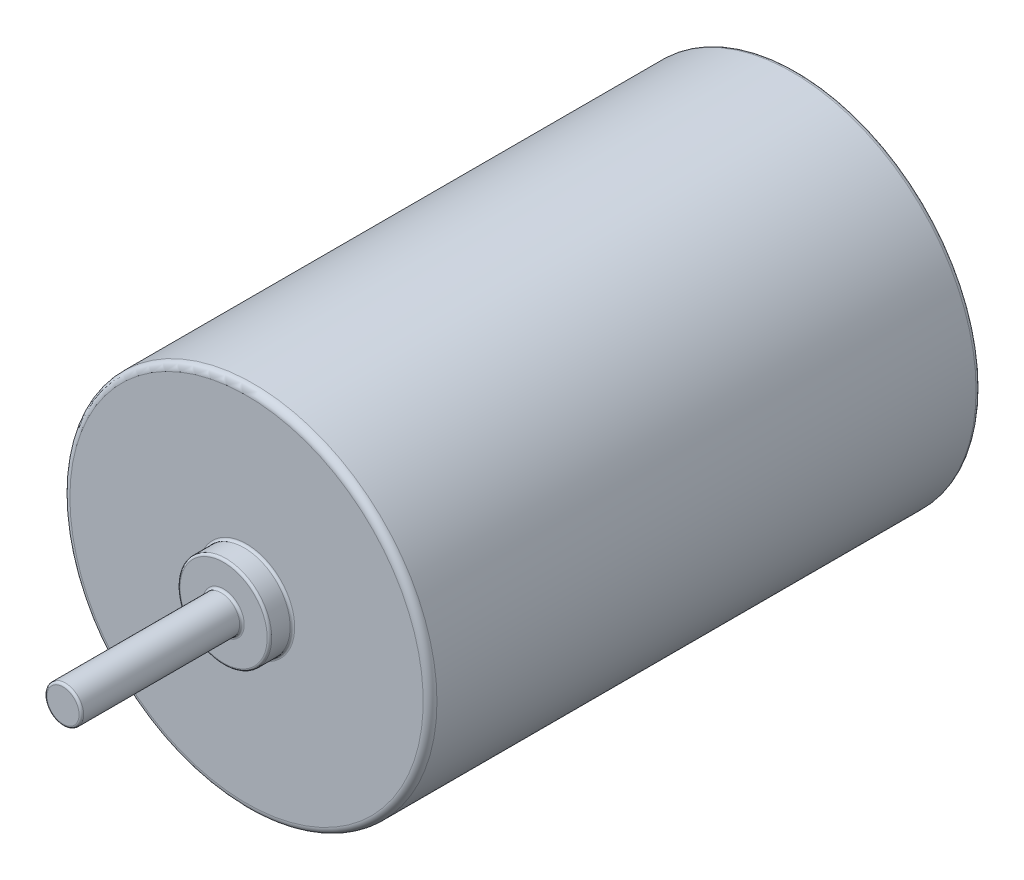
ISO-10303-21;
HEADER;
FILE_DESCRIPTION(('STEP AP214'),'2;1');
FILE_NAME('part.step','',(''),(''),'','','');
FILE_SCHEMA(('AUTOMOTIVE_DESIGN { 1 0 10303 214 1 1 1 1 }'));
ENDSEC;
DATA;
#1=APPLICATION_CONTEXT('core data for automotive mechanical design processes');
#2=APPLICATION_PROTOCOL_DEFINITION('international standard','automotive_design',2000,#1);
#3=PRODUCT_CONTEXT('',#1,'mechanical');
#4=PRODUCT('Part','Part','',(#3));
#5=PRODUCT_RELATED_PRODUCT_CATEGORY('part','',(#4));
#6=PRODUCT_DEFINITION_FORMATION('','',#4);
#7=PRODUCT_DEFINITION_CONTEXT('part definition',#1,'design');
#8=PRODUCT_DEFINITION('design','',#6,#7);
#9=PRODUCT_DEFINITION_SHAPE('','',#8);
#10=(LENGTH_UNIT() NAMED_UNIT(*) SI_UNIT(.MILLI.,.METRE.));
#11=(NAMED_UNIT(*) PLANE_ANGLE_UNIT() SI_UNIT($,.RADIAN.));
#12=(NAMED_UNIT(*) SI_UNIT($,.STERADIAN.) SOLID_ANGLE_UNIT());
#13=UNCERTAINTY_MEASURE_WITH_UNIT(LENGTH_MEASURE(1.E-05),#10,'distance_accuracy_value','');
#14=(GEOMETRIC_REPRESENTATION_CONTEXT(3) GLOBAL_UNCERTAINTY_ASSIGNED_CONTEXT((#13)) GLOBAL_UNIT_ASSIGNED_CONTEXT((#10,
#11,#12)) REPRESENTATION_CONTEXT('',''));
#15=CARTESIAN_POINT('',(0.,0.,0.));
#16=DIRECTION('',(0.,0.,1.));
#17=DIRECTION('',(1.,0.,0.));
#18=AXIS2_PLACEMENT_3D('',#15,#16,#17);
#19=CARTESIAN_POINT('',(0.,4.,0.));
#20=DIRECTION('',(0.,0.,-1.));
#21=DIRECTION('',(-1.,0.,0.));
#22=AXIS2_PLACEMENT_3D('',#19,#20,#21);
#23=PLANE('',#22);
#24=CARTESIAN_POINT('',(0.,0.,0.));
#25=DIRECTION('',(0.,0.,-1.));
#26=DIRECTION('',(-1.,0.,0.));
#27=AXIS2_PLACEMENT_3D('',#24,#25,#26);
#28=CIRCLE('',#27,3.85);
#29=CARTESIAN_POINT('',(-3.85,0.,0.));
#30=VERTEX_POINT('',#29);
#31=EDGE_CURVE('E48',#30,#30,#28,.F.);
#32=ORIENTED_EDGE('',*,*,#31,.T.);
#33=EDGE_LOOP('',(#32));
#34=FACE_BOUND('',#33,.T.);
#35=CARTESIAN_POINT('',(0.,0.,0.));
#36=DIRECTION('',(0.,0.,-1.));
#37=DIRECTION('',(-1.,0.,0.));
#38=AXIS2_PLACEMENT_3D('',#35,#36,#37);
#39=CIRCLE('',#38,1.05);
#40=CARTESIAN_POINT('',(-1.05,0.,0.));
#41=VERTEX_POINT('',#40);
#42=EDGE_CURVE('E68',#41,#41,#39,.T.);
#43=ORIENTED_EDGE('',*,*,#42,.T.);
#44=EDGE_LOOP('',(#43));
#45=FACE_BOUND('',#44,.T.);
#46=ADVANCED_FACE('F33',(#34,#45),#23,.F.);
#47=CARTESIAN_POINT('',(0.,0.,94.8303325897492));
#48=DIRECTION('',(0.,0.,1.));
#49=DIRECTION('',(1.,0.,0.));
#50=AXIS2_PLACEMENT_3D('',#47,#48,#49);
#51=CYLINDRICAL_SURFACE('',#50,4.);
#52=CARTESIAN_POINT('',(0.,0.,-11.9));
#53=DIRECTION('',(0.,0.,1.));
#54=DIRECTION('',(1.,0.,0.));
#55=AXIS2_PLACEMENT_3D('',#52,#53,#54);
#56=CIRCLE('',#55,4.);
#57=CARTESIAN_POINT('',(4.,0.,-11.9));
#58=VERTEX_POINT('',#57);
#59=EDGE_CURVE('E40',#58,#58,#56,.T.);
#60=ORIENTED_EDGE('',*,*,#59,.T.);
#61=EDGE_LOOP('',(#60));
#62=FACE_BOUND('',#61,.T.);
#63=CARTESIAN_POINT('',(0.,0.,-0.149999999999997));
#64=DIRECTION('',(0.,0.,-1.));
#65=DIRECTION('',(-1.,0.,0.));
#66=AXIS2_PLACEMENT_3D('',#63,#64,#65);
#67=CIRCLE('',#66,4.);
#68=CARTESIAN_POINT('',(-4.,0.,-0.149999999999997));
#69=VERTEX_POINT('',#68);
#70=EDGE_CURVE('E44',#69,#69,#67,.T.);
#71=ORIENTED_EDGE('',*,*,#70,.T.);
#72=EDGE_LOOP('',(#71));
#73=FACE_BOUND('',#72,.T.);
#74=ADVANCED_FACE('F119',(#62,#73),#51,.T.);
#75=CARTESIAN_POINT('',(0.,4.,-12.));
#76=DIRECTION('',(0.,0.,1.));
#77=DIRECTION('',(1.,0.,0.));
#78=AXIS2_PLACEMENT_3D('',#75,#76,#77);
#79=PLANE('',#78);
#80=CARTESIAN_POINT('',(0.,0.,-12.));
#81=DIRECTION('',(0.,0.,1.));
#82=DIRECTION('',(1.,0.,0.));
#83=AXIS2_PLACEMENT_3D('',#80,#81,#82);
#84=CIRCLE('',#83,3.9);
#85=CARTESIAN_POINT('',(3.9,0.,-12.));
#86=VERTEX_POINT('',#85);
#87=EDGE_CURVE('E10',#86,#86,#84,.F.);
#88=ORIENTED_EDGE('',*,*,#87,.T.);
#89=EDGE_LOOP('',(#88));
#90=FACE_BOUND('',#89,.T.);
#91=ADVANCED_FACE('F114',(#90),#79,.F.);
#92=CARTESIAN_POINT('',(0.,0.4,4.));
#93=DIRECTION('',(0.,0.,-1.));
#94=DIRECTION('',(-1.,0.,0.));
#95=AXIS2_PLACEMENT_3D('',#92,#93,#94);
#96=PLANE('',#95);
#97=CARTESIAN_POINT('',(0.,0.,4.));
#98=DIRECTION('',(0.,0.,-1.));
#99=DIRECTION('',(-1.,0.,0.));
#100=AXIS2_PLACEMENT_3D('',#97,#98,#99);
#101=CIRCLE('',#100,0.35);
#102=CARTESIAN_POINT('',(-0.35,0.,4.));
#103=VERTEX_POINT('',#102);
#104=EDGE_CURVE('E53',#103,#103,#101,.F.);
#105=ORIENTED_EDGE('',*,*,#104,.T.);
#106=EDGE_LOOP('',(#105));
#107=FACE_BOUND('',#106,.T.);
#108=ADVANCED_FACE('F103',(#107),#96,.F.);
#109=CARTESIAN_POINT('',(0.,0.,94.8303325897492));
#110=DIRECTION('',(0.,0.,1.));
#111=DIRECTION('',(1.,0.,0.));
#112=AXIS2_PLACEMENT_3D('',#109,#110,#111);
#113=CYLINDRICAL_SURFACE('',#112,0.4);
#114=CARTESIAN_POINT('',(0.,0.,0.549999999999995));
#115=DIRECTION('',(0.,0.,-1.));
#116=DIRECTION('',(-1.,0.,0.));
#117=AXIS2_PLACEMENT_3D('',#114,#115,#116);
#118=CIRCLE('',#117,0.4);
#119=CARTESIAN_POINT('',(-0.4,0.,0.549999999999995));
#120=VERTEX_POINT('',#119);
#121=EDGE_CURVE('E56',#120,#120,#118,.F.);
#122=ORIENTED_EDGE('',*,*,#121,.T.);
#123=EDGE_LOOP('',(#122));
#124=FACE_BOUND('',#123,.T.);
#125=CARTESIAN_POINT('',(0.,0.,3.95));
#126=DIRECTION('',(0.,0.,-1.));
#127=DIRECTION('',(-1.,0.,0.));
#128=AXIS2_PLACEMENT_3D('',#125,#126,#127);
#129=CIRCLE('',#128,0.4);
#130=CARTESIAN_POINT('',(-0.4,0.,3.95));
#131=VERTEX_POINT('',#130);
#132=EDGE_CURVE('E59',#131,#131,#129,.T.);
#133=ORIENTED_EDGE('',*,*,#132,.T.);
#134=EDGE_LOOP('',(#133));
#135=FACE_BOUND('',#134,.T.);
#136=ADVANCED_FACE('F91',(#124,#135),#113,.T.);
#137=CARTESIAN_POINT('',(0.,1.,0.5));
#138=DIRECTION('',(0.,0.,-1.));
#139=DIRECTION('',(-1.,0.,0.));
#140=AXIS2_PLACEMENT_3D('',#137,#138,#139);
#141=PLANE('',#140);
#142=CARTESIAN_POINT('',(0.,0.,0.5));
#143=DIRECTION('',(0.,0.,-1.));
#144=DIRECTION('',(-1.,0.,0.));
#145=AXIS2_PLACEMENT_3D('',#142,#143,#144);
#146=CIRCLE('',#145,0.95);
#147=CARTESIAN_POINT('',(-0.95,0.,0.5));
#148=VERTEX_POINT('',#147);
#149=EDGE_CURVE('E62',#148,#148,#146,.F.);
#150=ORIENTED_EDGE('',*,*,#149,.T.);
#151=EDGE_LOOP('',(#150));
#152=FACE_BOUND('',#151,.T.);
#153=CARTESIAN_POINT('',(0.,0.,0.5));
#154=DIRECTION('',(0.,0.,-1.));
#155=DIRECTION('',(-1.,0.,0.));
#156=AXIS2_PLACEMENT_3D('',#153,#154,#155);
#157=CIRCLE('',#156,0.45);
#158=CARTESIAN_POINT('',(-0.45,0.,0.5));
#159=VERTEX_POINT('',#158);
#160=EDGE_CURVE('E65',#159,#159,#157,.T.);
#161=ORIENTED_EDGE('',*,*,#160,.T.);
#162=EDGE_LOOP('',(#161));
#163=FACE_BOUND('',#162,.T.);
#164=ADVANCED_FACE('F88',(#152,#163),#141,.F.);
#165=CARTESIAN_POINT('',(0.,0.,94.8303325897492));
#166=DIRECTION('',(0.,0.,1.));
#167=DIRECTION('',(1.,0.,0.));
#168=AXIS2_PLACEMENT_3D('',#165,#166,#167);
#169=CYLINDRICAL_SURFACE('',#168,1.);
#170=CARTESIAN_POINT('',(0.,0.,0.0499999999999945));
#171=DIRECTION('',(0.,0.,-1.));
#172=DIRECTION('',(-1.,0.,0.));
#173=AXIS2_PLACEMENT_3D('',#170,#171,#172);
#174=CIRCLE('',#173,1.);
#175=CARTESIAN_POINT('',(-1.,0.,0.0499999999999945));
#176=VERTEX_POINT('',#175);
#177=EDGE_CURVE('E71',#176,#176,#174,.F.);
#178=ORIENTED_EDGE('',*,*,#177,.T.);
#179=EDGE_LOOP('',(#178));
#180=FACE_BOUND('',#179,.T.);
#181=CARTESIAN_POINT('',(0.,0.,0.450000000000006));
#182=DIRECTION('',(0.,0.,-1.));
#183=DIRECTION('',(-1.,0.,0.));
#184=AXIS2_PLACEMENT_3D('',#181,#182,#183);
#185=CIRCLE('',#184,1.);
#186=CARTESIAN_POINT('',(-1.,0.,0.450000000000006));
#187=VERTEX_POINT('',#186);
#188=EDGE_CURVE('E74',#187,#187,#185,.T.);
#189=ORIENTED_EDGE('',*,*,#188,.T.);
#190=EDGE_LOOP('',(#189));
#191=FACE_BOUND('',#190,.T.);
#192=ADVANCED_FACE('F78',(#180,#191),#169,.T.);
#193=CARTESIAN_POINT('',(0.,0.,0.0499999999999945));
#194=DIRECTION('',(0.,0.,-1.));
#195=DIRECTION('',(-1.,0.,0.));
#196=AXIS2_PLACEMENT_3D('',#193,#194,#195);
#197=TOROIDAL_SURFACE('',#196,1.05,0.05);
#198=ORIENTED_EDGE('',*,*,#42,.F.);
#199=EDGE_LOOP('',(#198));
#200=FACE_BOUND('',#199,.T.);
#201=ORIENTED_EDGE('',*,*,#177,.F.);
#202=EDGE_LOOP('',(#201));
#203=FACE_BOUND('',#202,.T.);
#204=ADVANCED_FACE('F84',(#200,#203),#197,.F.);
#205=CARTESIAN_POINT('',(0.,0.,0.450000000000006));
#206=DIRECTION('',(0.,0.,-1.));
#207=DIRECTION('',(-1.,0.,0.));
#208=AXIS2_PLACEMENT_3D('',#205,#206,#207);
#209=TOROIDAL_SURFACE('',#208,0.95,0.05);
#210=ORIENTED_EDGE('',*,*,#188,.F.);
#211=EDGE_LOOP('',(#210));
#212=FACE_BOUND('',#211,.T.);
#213=ORIENTED_EDGE('',*,*,#149,.F.);
#214=EDGE_LOOP('',(#213));
#215=FACE_BOUND('',#214,.T.);
#216=ADVANCED_FACE('F80',(#212,#215),#209,.T.);
#217=CARTESIAN_POINT('',(0.,0.,0.549999999999995));
#218=DIRECTION('',(0.,0.,-1.));
#219=DIRECTION('',(-1.,0.,0.));
#220=AXIS2_PLACEMENT_3D('',#217,#218,#219);
#221=TOROIDAL_SURFACE('',#220,0.45,0.05);
#222=ORIENTED_EDGE('',*,*,#160,.F.);
#223=EDGE_LOOP('',(#222));
#224=FACE_BOUND('',#223,.T.);
#225=ORIENTED_EDGE('',*,*,#121,.F.);
#226=EDGE_LOOP('',(#225));
#227=FACE_BOUND('',#226,.T.);
#228=ADVANCED_FACE('F83',(#224,#227),#221,.F.);
#229=CARTESIAN_POINT('',(0.,0.,3.95));
#230=DIRECTION('',(0.,0.,-1.));
#231=DIRECTION('',(-1.,0.,0.));
#232=AXIS2_PLACEMENT_3D('',#229,#230,#231);
#233=TOROIDAL_SURFACE('',#232,0.35,0.05);
#234=ORIENTED_EDGE('',*,*,#132,.F.);
#235=EDGE_LOOP('',(#234));
#236=FACE_BOUND('',#235,.T.);
#237=ORIENTED_EDGE('',*,*,#104,.F.);
#238=EDGE_LOOP('',(#237));
#239=FACE_BOUND('',#238,.T.);
#240=ADVANCED_FACE('F97',(#236,#239),#233,.T.);
#241=CARTESIAN_POINT('',(0.,0.,-0.149999999999997));
#242=DIRECTION('',(0.,0.,-1.));
#243=DIRECTION('',(-1.,0.,0.));
#244=AXIS2_PLACEMENT_3D('',#241,#242,#243);
#245=TOROIDAL_SURFACE('',#244,3.85,0.15);
#246=ORIENTED_EDGE('',*,*,#70,.F.);
#247=EDGE_LOOP('',(#246));
#248=FACE_BOUND('',#247,.T.);
#249=ORIENTED_EDGE('',*,*,#31,.F.);
#250=EDGE_LOOP('',(#249));
#251=FACE_BOUND('',#250,.T.);
#252=ADVANCED_FACE('F109',(#248,#251),#245,.T.);
#253=CARTESIAN_POINT('',(0.,0.,-11.9));
#254=DIRECTION('',(0.,0.,1.));
#255=DIRECTION('',(1.,0.,0.));
#256=AXIS2_PLACEMENT_3D('',#253,#254,#255);
#257=TOROIDAL_SURFACE('',#256,3.9,0.1);
#258=ORIENTED_EDGE('',*,*,#87,.F.);
#259=EDGE_LOOP('',(#258));
#260=FACE_BOUND('',#259,.T.);
#261=ORIENTED_EDGE('',*,*,#59,.F.);
#262=EDGE_LOOP('',(#261));
#263=FACE_BOUND('',#262,.T.);
#264=ADVANCED_FACE('F35',(#260,#263),#257,.T.);
#265=CLOSED_SHELL('',(#46,#74,#91,#108,#136,#164,#192,#204,#216,#228,#240,#252,#264));
#266=MANIFOLD_SOLID_BREP('B2',#265);
#267=ADVANCED_BREP_SHAPE_REPRESENTATION('',(#18,#266),#14);
#268=SHAPE_DEFINITION_REPRESENTATION(#9,#267);
ENDSEC;
END-ISO-10303-21;
